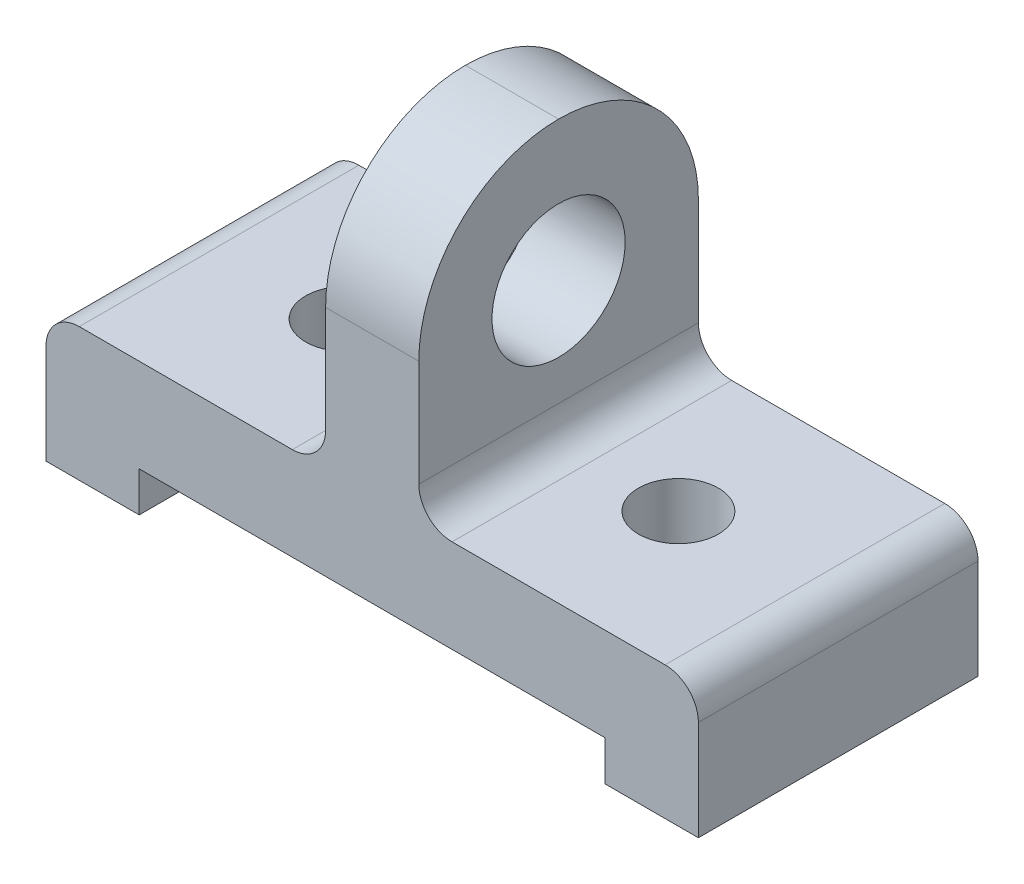
ISO-10303-21;
HEADER;
FILE_DESCRIPTION(('STEP AP214'),'2;1');
FILE_NAME('part.step','',(''),(''),'','','');
FILE_SCHEMA(('AUTOMOTIVE_DESIGN { 1 0 10303 214 1 1 1 1 }'));
ENDSEC;
DATA;
#1=APPLICATION_CONTEXT('core data for automotive mechanical design processes');
#2=APPLICATION_PROTOCOL_DEFINITION('international standard','automotive_design',2000,#1);
#3=PRODUCT_CONTEXT('',#1,'mechanical');
#4=PRODUCT('Part','Part','',(#3));
#5=PRODUCT_RELATED_PRODUCT_CATEGORY('part','',(#4));
#6=PRODUCT_DEFINITION_FORMATION('','',#4);
#7=PRODUCT_DEFINITION_CONTEXT('part definition',#1,'design');
#8=PRODUCT_DEFINITION('design','',#6,#7);
#9=PRODUCT_DEFINITION_SHAPE('','',#8);
#10=(LENGTH_UNIT() NAMED_UNIT(*) SI_UNIT(.MILLI.,.METRE.));
#11=(NAMED_UNIT(*) PLANE_ANGLE_UNIT() SI_UNIT($,.RADIAN.));
#12=(NAMED_UNIT(*) SI_UNIT($,.STERADIAN.) SOLID_ANGLE_UNIT());
#13=UNCERTAINTY_MEASURE_WITH_UNIT(LENGTH_MEASURE(1.E-05),#10,'distance_accuracy_value','');
#14=(GEOMETRIC_REPRESENTATION_CONTEXT(3) GLOBAL_UNCERTAINTY_ASSIGNED_CONTEXT((#13)) GLOBAL_UNIT_ASSIGNED_CONTEXT((#10,
#11,#12)) REPRESENTATION_CONTEXT('',''));
#15=CARTESIAN_POINT('',(0.,0.,0.));
#16=DIRECTION('',(0.,0.,1.));
#17=DIRECTION('',(1.,0.,0.));
#18=AXIS2_PLACEMENT_3D('',#15,#16,#17);
#19=CARTESIAN_POINT('',(0.,50.8,0.));
#20=DIRECTION('',(0.,1.,0.));
#21=DIRECTION('',(0.,0.,1.));
#22=AXIS2_PLACEMENT_3D('',#19,#20,#21);
#23=PLANE('',#22);
#24=CARTESIAN_POINT('',(187.96,50.8,53.34));
#25=DIRECTION('',(0.,1.,0.));
#26=DIRECTION('',(0.,0.,1.));
#27=AXIS2_PLACEMENT_3D('',#24,#25,#26);
#28=CIRCLE('',#27,15.24);
#29=CARTESIAN_POINT('',(187.96,50.8,68.58));
#30=VERTEX_POINT('',#29);
#31=EDGE_CURVE('E316',#30,#30,#28,.T.);
#32=ORIENTED_EDGE('',*,*,#31,.F.);
#33=EDGE_LOOP('',(#32));
#34=FACE_BOUND('',#33,.T.);
#35=DIRECTION('',(-1.,0.,0.));
#36=VECTOR('',#35,1.);
#37=CARTESIAN_POINT('',(0.,50.8,0.));
#38=LINE('',#37,#36);
#39=CARTESIAN_POINT('',(236.22,50.8,0.));
#40=VERTEX_POINT('',#39);
#41=CARTESIAN_POINT('',(154.94,50.8,0.));
#42=VERTEX_POINT('',#41);
#43=EDGE_CURVE('E193',#40,#42,#38,.T.);
#44=ORIENTED_EDGE('',*,*,#43,.T.);
#45=DIRECTION('',(0.,0.,1.));
#46=VECTOR('',#45,1.);
#47=CARTESIAN_POINT('',(154.94,50.8,106.68));
#48=LINE('',#47,#46);
#49=CARTESIAN_POINT('',(154.94,50.8,106.68));
#50=VERTEX_POINT('',#49);
#51=EDGE_CURVE('E258',#42,#50,#48,.T.);
#52=ORIENTED_EDGE('',*,*,#51,.T.);
#53=DIRECTION('',(1.,0.,0.));
#54=VECTOR('',#53,1.);
#55=CARTESIAN_POINT('',(0.,50.8,106.68));
#56=LINE('',#55,#54);
#57=CARTESIAN_POINT('',(236.22,50.8,106.68));
#58=VERTEX_POINT('',#57);
#59=EDGE_CURVE('E191',#50,#58,#56,.T.);
#60=ORIENTED_EDGE('',*,*,#59,.T.);
#61=DIRECTION('',(0.,0.,-1.));
#62=VECTOR('',#61,1.);
#63=CARTESIAN_POINT('',(236.22,50.8,0.));
#64=LINE('',#63,#62);
#65=EDGE_CURVE('E233',#58,#40,#64,.T.);
#66=ORIENTED_EDGE('',*,*,#65,.T.);
#67=EDGE_LOOP('',(#44,#52,#60,#66));
#68=FACE_BOUND('',#67,.T.);
#69=ADVANCED_FACE('F39',(#34,#68),#23,.T.);
#70=CARTESIAN_POINT('',(0.,0.,0.));
#71=DIRECTION('',(0.,1.,0.));
#72=DIRECTION('',(0.,0.,1.));
#73=AXIS2_PLACEMENT_3D('',#70,#71,#72);
#74=PLANE('',#73);
#75=DIRECTION('',(0.,0.,-1.));
#76=VECTOR('',#75,1.);
#77=CARTESIAN_POINT('',(35.56,0.,106.68));
#78=LINE('',#77,#76);
#79=CARTESIAN_POINT('',(35.56,0.,106.68));
#80=VERTEX_POINT('',#79);
#81=CARTESIAN_POINT('',(35.56,0.,0.));
#82=VERTEX_POINT('',#81);
#83=EDGE_CURVE('E310',#80,#82,#78,.T.);
#84=ORIENTED_EDGE('',*,*,#83,.F.);
#85=DIRECTION('',(1.,0.,0.));
#86=VECTOR('',#85,1.);
#87=CARTESIAN_POINT('',(0.,0.,106.68));
#88=LINE('',#87,#86);
#89=CARTESIAN_POINT('',(0.,0.,106.68));
#90=VERTEX_POINT('',#89);
#91=EDGE_CURVE('E203',#90,#80,#88,.T.);
#92=ORIENTED_EDGE('',*,*,#91,.F.);
#93=DIRECTION('',(0.,0.,1.));
#94=VECTOR('',#93,1.);
#95=CARTESIAN_POINT('',(0.,0.,0.));
#96=LINE('',#95,#94);
#97=CARTESIAN_POINT('',(0.,0.,0.));
#98=VERTEX_POINT('',#97);
#99=EDGE_CURVE('E197',#98,#90,#96,.T.);
#100=ORIENTED_EDGE('',*,*,#99,.F.);
#101=DIRECTION('',(-1.,0.,0.));
#102=VECTOR('',#101,1.);
#103=CARTESIAN_POINT('',(0.,0.,0.));
#104=LINE('',#103,#102);
#105=EDGE_CURVE('E209',#82,#98,#104,.T.);
#106=ORIENTED_EDGE('',*,*,#105,.F.);
#107=EDGE_LOOP('',(#84,#92,#100,#106));
#108=FACE_BOUND('',#107,.T.);
#109=ADVANCED_FACE('F306',(#108),#74,.F.);
#110=DIRECTION('',(0.,0.,1.));
#111=VECTOR('',#110,1.);
#112=CARTESIAN_POINT('',(213.36,0.,106.68));
#113=LINE('',#112,#111);
#114=CARTESIAN_POINT('',(213.36,0.,0.));
#115=VERTEX_POINT('',#114);
#116=CARTESIAN_POINT('',(213.36,0.,106.68));
#117=VERTEX_POINT('',#116);
#118=EDGE_CURVE('E311',#115,#117,#113,.T.);
#119=ORIENTED_EDGE('',*,*,#118,.F.);
#120=CARTESIAN_POINT('',(248.92,0.,0.));
#121=VERTEX_POINT('',#120);
#122=EDGE_CURVE('E185',#121,#115,#104,.T.);
#123=ORIENTED_EDGE('',*,*,#122,.F.);
#124=DIRECTION('',(0.,0.,-1.));
#125=VECTOR('',#124,1.);
#126=CARTESIAN_POINT('',(248.92,0.,0.));
#127=LINE('',#126,#125);
#128=CARTESIAN_POINT('',(248.92,0.,106.68));
#129=VERTEX_POINT('',#128);
#130=EDGE_CURVE('E207',#129,#121,#127,.T.);
#131=ORIENTED_EDGE('',*,*,#130,.F.);
#132=EDGE_CURVE('E205',#117,#129,#88,.T.);
#133=ORIENTED_EDGE('',*,*,#132,.F.);
#134=EDGE_LOOP('',(#119,#123,#131,#133));
#135=FACE_BOUND('',#134,.T.);
#136=ADVANCED_FACE('F370',(#135),#74,.F.);
#137=CARTESIAN_POINT('',(0.,50.8,0.));
#138=DIRECTION('',(1.,0.,0.));
#139=DIRECTION('',(0.,0.,-1.));
#140=AXIS2_PLACEMENT_3D('',#137,#138,#139);
#141=PLANE('',#140);
#142=DIRECTION('',(0.,-1.,0.));
#143=VECTOR('',#142,1.);
#144=CARTESIAN_POINT('',(0.,50.8,106.68));
#145=LINE('',#144,#143);
#146=CARTESIAN_POINT('',(0.,38.1,106.68));
#147=VERTEX_POINT('',#146);
#148=EDGE_CURVE('E216',#147,#90,#145,.T.);
#149=ORIENTED_EDGE('',*,*,#148,.F.);
#150=DIRECTION('',(0.,0.,1.));
#151=VECTOR('',#150,1.);
#152=CARTESIAN_POINT('',(0.,38.1,0.));
#153=LINE('',#152,#151);
#154=CARTESIAN_POINT('',(0.,38.1,0.));
#155=VERTEX_POINT('',#154);
#156=EDGE_CURVE('E254',#147,#155,#153,.F.);
#157=ORIENTED_EDGE('',*,*,#156,.T.);
#158=DIRECTION('',(0.,-1.,0.));
#159=VECTOR('',#158,1.);
#160=CARTESIAN_POINT('',(0.,50.8,0.));
#161=LINE('',#160,#159);
#162=EDGE_CURVE('E198',#155,#98,#161,.T.);
#163=ORIENTED_EDGE('',*,*,#162,.T.);
#164=ORIENTED_EDGE('',*,*,#99,.T.);
#165=EDGE_LOOP('',(#149,#157,#163,#164));
#166=FACE_BOUND('',#165,.T.);
#167=ADVANCED_FACE('F299',(#166),#141,.F.);
#168=CARTESIAN_POINT('',(0.,50.8,106.68));
#169=DIRECTION('',(0.,0.,-1.));
#170=DIRECTION('',(-1.,0.,0.));
#171=AXIS2_PLACEMENT_3D('',#168,#169,#170);
#172=PLANE('',#171);
#173=DIRECTION('',(0.,-1.,0.));
#174=VECTOR('',#173,1.);
#175=CARTESIAN_POINT('',(248.92,50.8,106.68));
#176=LINE('',#175,#174);
#177=CARTESIAN_POINT('',(248.92,38.1,106.68));
#178=VERTEX_POINT('',#177);
#179=EDGE_CURVE('E211',#178,#129,#176,.T.);
#180=ORIENTED_EDGE('',*,*,#179,.F.);
#181=CARTESIAN_POINT('',(236.22,38.1,106.68));
#182=DIRECTION('',(0.,0.,-1.));
#183=DIRECTION('',(-1.,0.,0.));
#184=AXIS2_PLACEMENT_3D('',#181,#182,#183);
#185=CIRCLE('',#184,12.7);
#186=EDGE_CURVE('E250',#178,#58,#185,.F.);
#187=ORIENTED_EDGE('',*,*,#186,.T.);
#188=ORIENTED_EDGE('',*,*,#59,.F.);
#189=CARTESIAN_POINT('',(154.94,63.5,106.68));
#190=DIRECTION('',(0.,0.,-1.));
#191=DIRECTION('',(-1.,0.,0.));
#192=AXIS2_PLACEMENT_3D('',#189,#190,#191);
#193=CIRCLE('',#192,12.7);
#194=CARTESIAN_POINT('',(142.24,63.5,106.68));
#195=VERTEX_POINT('',#194);
#196=EDGE_CURVE('E50',#50,#195,#193,.T.);
#197=ORIENTED_EDGE('',*,*,#196,.T.);
#198=DIRECTION('',(0.,-1.,0.));
#199=VECTOR('',#198,1.);
#200=CARTESIAN_POINT('',(142.24,157.48,106.68));
#201=LINE('',#200,#199);
#202=CARTESIAN_POINT('',(142.24,104.14,106.68));
#203=VERTEX_POINT('',#202);
#204=EDGE_CURVE('E327',#203,#195,#201,.T.);
#205=ORIENTED_EDGE('',*,*,#204,.F.);
#206=DIRECTION('',(1.,0.,0.));
#207=VECTOR('',#206,1.);
#208=CARTESIAN_POINT('',(0.,104.14,106.68));
#209=LINE('',#208,#207);
#210=CARTESIAN_POINT('',(106.68,104.14,106.68));
#211=VERTEX_POINT('',#210);
#212=EDGE_CURVE('E225',#203,#211,#209,.F.);
#213=ORIENTED_EDGE('',*,*,#212,.T.);
#214=DIRECTION('',(0.,-1.,0.));
#215=VECTOR('',#214,1.);
#216=CARTESIAN_POINT('',(106.68,157.48,106.68));
#217=LINE('',#216,#215);
#218=CARTESIAN_POINT('',(106.68,63.5,106.68));
#219=VERTEX_POINT('',#218);
#220=EDGE_CURVE('E285',#211,#219,#217,.T.);
#221=ORIENTED_EDGE('',*,*,#220,.T.);
#222=CARTESIAN_POINT('',(93.98,63.5,106.68));
#223=DIRECTION('',(0.,0.,-1.));
#224=DIRECTION('',(-1.,0.,0.));
#225=AXIS2_PLACEMENT_3D('',#222,#223,#224);
#226=CIRCLE('',#225,12.7);
#227=CARTESIAN_POINT('',(93.98,50.8,106.68));
#228=VERTEX_POINT('',#227);
#229=EDGE_CURVE('E262',#219,#228,#226,.T.);
#230=ORIENTED_EDGE('',*,*,#229,.T.);
#231=CARTESIAN_POINT('',(12.7,50.8,106.68));
#232=VERTEX_POINT('',#231);
#233=EDGE_CURVE('E188',#232,#228,#56,.T.);
#234=ORIENTED_EDGE('',*,*,#233,.F.);
#235=CARTESIAN_POINT('',(12.7,38.1,106.68));
#236=DIRECTION('',(0.,0.,-1.));
#237=DIRECTION('',(-1.,0.,0.));
#238=AXIS2_PLACEMENT_3D('',#235,#236,#237);
#239=CIRCLE('',#238,12.7);
#240=EDGE_CURVE('E244',#232,#147,#239,.F.);
#241=ORIENTED_EDGE('',*,*,#240,.T.);
#242=ORIENTED_EDGE('',*,*,#148,.T.);
#243=ORIENTED_EDGE('',*,*,#91,.T.);
#244=DIRECTION('',(0.,-1.,0.));
#245=VECTOR('',#244,1.);
#246=CARTESIAN_POINT('',(35.56,15.24,106.68));
#247=LINE('',#246,#245);
#248=CARTESIAN_POINT('',(35.56,15.24,106.68));
#249=VERTEX_POINT('',#248);
#250=EDGE_CURVE('E184',#249,#80,#247,.T.);
#251=ORIENTED_EDGE('',*,*,#250,.F.);
#252=DIRECTION('',(-1.,0.,0.));
#253=VECTOR('',#252,1.);
#254=CARTESIAN_POINT('',(35.56,15.24,106.68));
#255=LINE('',#254,#253);
#256=CARTESIAN_POINT('',(213.36,15.24,106.68));
#257=VERTEX_POINT('',#256);
#258=EDGE_CURVE('E166',#257,#249,#255,.T.);
#259=ORIENTED_EDGE('',*,*,#258,.F.);
#260=DIRECTION('',(0.,-1.,0.));
#261=VECTOR('',#260,1.);
#262=CARTESIAN_POINT('',(213.36,15.24,106.68));
#263=LINE('',#262,#261);
#264=EDGE_CURVE('E165',#257,#117,#263,.T.);
#265=ORIENTED_EDGE('',*,*,#264,.T.);
#266=ORIENTED_EDGE('',*,*,#132,.T.);
#267=EDGE_LOOP('',(#180,#187,#188,#197,#205,#213,#221,#230,#234,#241,#242,#243,#251,#259,#265,#266));
#268=FACE_BOUND('',#267,.T.);
#269=ADVANCED_FACE('F290',(#268),#172,.F.);
#270=CARTESIAN_POINT('',(248.92,50.8,0.));
#271=DIRECTION('',(-1.,0.,0.));
#272=DIRECTION('',(0.,0.,1.));
#273=AXIS2_PLACEMENT_3D('',#270,#271,#272);
#274=PLANE('',#273);
#275=DIRECTION('',(0.,-1.,0.));
#276=VECTOR('',#275,1.);
#277=CARTESIAN_POINT('',(248.92,50.8,0.));
#278=LINE('',#277,#276);
#279=CARTESIAN_POINT('',(248.92,38.1,0.));
#280=VERTEX_POINT('',#279);
#281=EDGE_CURVE('E215',#280,#121,#278,.T.);
#282=ORIENTED_EDGE('',*,*,#281,.F.);
#283=DIRECTION('',(0.,0.,-1.));
#284=VECTOR('',#283,1.);
#285=CARTESIAN_POINT('',(248.92,38.1,106.68));
#286=LINE('',#285,#284);
#287=EDGE_CURVE('E243',#280,#178,#286,.F.);
#288=ORIENTED_EDGE('',*,*,#287,.T.);
#289=ORIENTED_EDGE('',*,*,#179,.T.);
#290=ORIENTED_EDGE('',*,*,#130,.T.);
#291=EDGE_LOOP('',(#282,#288,#289,#290));
#292=FACE_BOUND('',#291,.T.);
#293=ADVANCED_FACE('F365',(#292),#274,.F.);
#294=CARTESIAN_POINT('',(0.,50.8,0.));
#295=DIRECTION('',(0.,0.,1.));
#296=DIRECTION('',(1.,0.,0.));
#297=AXIS2_PLACEMENT_3D('',#294,#295,#296);
#298=PLANE('',#297);
#299=ORIENTED_EDGE('',*,*,#43,.F.);
#300=CARTESIAN_POINT('',(236.22,38.1,0.));
#301=DIRECTION('',(0.,0.,1.));
#302=DIRECTION('',(1.,0.,0.));
#303=AXIS2_PLACEMENT_3D('',#300,#301,#302);
#304=CIRCLE('',#303,12.7);
#305=EDGE_CURVE('E241',#40,#280,#304,.F.);
#306=ORIENTED_EDGE('',*,*,#305,.T.);
#307=ORIENTED_EDGE('',*,*,#281,.T.);
#308=ORIENTED_EDGE('',*,*,#122,.T.);
#309=DIRECTION('',(0.,-1.,0.));
#310=VECTOR('',#309,1.);
#311=CARTESIAN_POINT('',(213.36,15.24,0.));
#312=LINE('',#311,#310);
#313=CARTESIAN_POINT('',(213.36,15.24,0.));
#314=VERTEX_POINT('',#313);
#315=EDGE_CURVE('E163',#314,#115,#312,.T.);
#316=ORIENTED_EDGE('',*,*,#315,.F.);
#317=DIRECTION('',(1.,0.,0.));
#318=VECTOR('',#317,1.);
#319=CARTESIAN_POINT('',(35.56,15.24,0.));
#320=LINE('',#319,#318);
#321=CARTESIAN_POINT('',(35.56,15.24,0.));
#322=VERTEX_POINT('',#321);
#323=EDGE_CURVE('E169',#322,#314,#320,.T.);
#324=ORIENTED_EDGE('',*,*,#323,.F.);
#325=DIRECTION('',(0.,-1.,0.));
#326=VECTOR('',#325,1.);
#327=CARTESIAN_POINT('',(35.56,15.24,0.));
#328=LINE('',#327,#326);
#329=EDGE_CURVE('E182',#322,#82,#328,.T.);
#330=ORIENTED_EDGE('',*,*,#329,.T.);
#331=ORIENTED_EDGE('',*,*,#105,.T.);
#332=ORIENTED_EDGE('',*,*,#162,.F.);
#333=CARTESIAN_POINT('',(12.7,38.1,0.));
#334=DIRECTION('',(0.,0.,1.));
#335=DIRECTION('',(1.,0.,0.));
#336=AXIS2_PLACEMENT_3D('',#333,#334,#335);
#337=CIRCLE('',#336,12.7);
#338=CARTESIAN_POINT('',(12.7,50.8,0.));
#339=VERTEX_POINT('',#338);
#340=EDGE_CURVE('E238',#155,#339,#337,.F.);
#341=ORIENTED_EDGE('',*,*,#340,.T.);
#342=CARTESIAN_POINT('',(93.98,50.8,0.));
#343=VERTEX_POINT('',#342);
#344=EDGE_CURVE('E194',#343,#339,#38,.T.);
#345=ORIENTED_EDGE('',*,*,#344,.F.);
#346=CARTESIAN_POINT('',(93.98,63.5,0.));
#347=DIRECTION('',(0.,0.,1.));
#348=DIRECTION('',(1.,0.,0.));
#349=AXIS2_PLACEMENT_3D('',#346,#347,#348);
#350=CIRCLE('',#349,12.7);
#351=CARTESIAN_POINT('',(106.68,63.5,0.));
#352=VERTEX_POINT('',#351);
#353=EDGE_CURVE('E266',#343,#352,#350,.T.);
#354=ORIENTED_EDGE('',*,*,#353,.T.);
#355=DIRECTION('',(0.,-1.,0.));
#356=VECTOR('',#355,1.);
#357=CARTESIAN_POINT('',(106.68,157.48,0.));
#358=LINE('',#357,#356);
#359=CARTESIAN_POINT('',(106.68,104.14,0.));
#360=VERTEX_POINT('',#359);
#361=EDGE_CURVE('E272',#360,#352,#358,.T.);
#362=ORIENTED_EDGE('',*,*,#361,.F.);
#363=DIRECTION('',(1.,0.,0.));
#364=VECTOR('',#363,1.);
#365=CARTESIAN_POINT('',(0.,104.14,0.));
#366=LINE('',#365,#364);
#367=CARTESIAN_POINT('',(142.24,104.14,0.));
#368=VERTEX_POINT('',#367);
#369=EDGE_CURVE('E230',#360,#368,#366,.T.);
#370=ORIENTED_EDGE('',*,*,#369,.T.);
#371=DIRECTION('',(0.,-1.,0.));
#372=VECTOR('',#371,1.);
#373=CARTESIAN_POINT('',(142.24,157.48,0.));
#374=LINE('',#373,#372);
#375=CARTESIAN_POINT('',(142.24,63.5,0.));
#376=VERTEX_POINT('',#375);
#377=EDGE_CURVE('E330',#368,#376,#374,.T.);
#378=ORIENTED_EDGE('',*,*,#377,.T.);
#379=CARTESIAN_POINT('',(154.94,63.5,0.));
#380=DIRECTION('',(0.,0.,1.));
#381=DIRECTION('',(1.,0.,0.));
#382=AXIS2_PLACEMENT_3D('',#379,#380,#381);
#383=CIRCLE('',#382,12.7);
#384=EDGE_CURVE('E11',#376,#42,#383,.T.);
#385=ORIENTED_EDGE('',*,*,#384,.T.);
#386=EDGE_LOOP('',(#299,#306,#307,#308,#316,#324,#330,#331,#332,#341,#345,#354,#362,#370,#378,#385));
#387=FACE_BOUND('',#386,.T.);
#388=ADVANCED_FACE('F179',(#387),#298,.F.);
#389=ORIENTED_EDGE('',*,*,#233,.T.);
#390=DIRECTION('',(0.,0.,1.));
#391=VECTOR('',#390,1.);
#392=CARTESIAN_POINT('',(93.98,50.8,0.));
#393=LINE('',#392,#391);
#394=EDGE_CURVE('E259',#228,#343,#393,.F.);
#395=ORIENTED_EDGE('',*,*,#394,.T.);
#396=ORIENTED_EDGE('',*,*,#344,.T.);
#397=DIRECTION('',(0.,0.,1.));
#398=VECTOR('',#397,1.);
#399=CARTESIAN_POINT('',(12.7,50.8,106.68));
#400=LINE('',#399,#398);
#401=EDGE_CURVE('E249',#339,#232,#400,.T.);
#402=ORIENTED_EDGE('',*,*,#401,.T.);
#403=EDGE_LOOP('',(#389,#395,#396,#402));
#404=FACE_BOUND('',#403,.T.);
#405=CARTESIAN_POINT('',(60.96,50.8,53.34));
#406=DIRECTION('',(0.,1.,0.));
#407=DIRECTION('',(0.,0.,1.));
#408=AXIS2_PLACEMENT_3D('',#405,#406,#407);
#409=CIRCLE('',#408,15.24);
#410=CARTESIAN_POINT('',(60.96,50.8,68.58));
#411=VERTEX_POINT('',#410);
#412=EDGE_CURVE('E325',#411,#411,#409,.T.);
#413=ORIENTED_EDGE('',*,*,#412,.F.);
#414=EDGE_LOOP('',(#413));
#415=FACE_BOUND('',#414,.T.);
#416=ADVANCED_FACE('F287',(#404,#415),#23,.T.);
#417=CARTESIAN_POINT('',(35.56,15.24,106.68));
#418=DIRECTION('',(-1.,0.,0.));
#419=DIRECTION('',(0.,0.,1.));
#420=AXIS2_PLACEMENT_3D('',#417,#418,#419);
#421=PLANE('',#420);
#422=ORIENTED_EDGE('',*,*,#83,.T.);
#423=ORIENTED_EDGE('',*,*,#329,.F.);
#424=DIRECTION('',(0.,0.,-1.));
#425=VECTOR('',#424,1.);
#426=CARTESIAN_POINT('',(35.56,15.24,106.68));
#427=LINE('',#426,#425);
#428=EDGE_CURVE('E173',#249,#322,#427,.T.);
#429=ORIENTED_EDGE('',*,*,#428,.F.);
#430=ORIENTED_EDGE('',*,*,#250,.T.);
#431=EDGE_LOOP('',(#422,#423,#429,#430));
#432=FACE_BOUND('',#431,.T.);
#433=ADVANCED_FACE('F390',(#432),#421,.F.);
#434=CARTESIAN_POINT('',(213.36,15.24,106.68));
#435=DIRECTION('',(1.,0.,0.));
#436=DIRECTION('',(0.,0.,-1.));
#437=AXIS2_PLACEMENT_3D('',#434,#435,#436);
#438=PLANE('',#437);
#439=ORIENTED_EDGE('',*,*,#118,.T.);
#440=ORIENTED_EDGE('',*,*,#264,.F.);
#441=DIRECTION('',(0.,0.,1.));
#442=VECTOR('',#441,1.);
#443=CARTESIAN_POINT('',(213.36,15.24,106.68));
#444=LINE('',#443,#442);
#445=EDGE_CURVE('E160',#314,#257,#444,.T.);
#446=ORIENTED_EDGE('',*,*,#445,.F.);
#447=ORIENTED_EDGE('',*,*,#315,.T.);
#448=EDGE_LOOP('',(#439,#440,#446,#447));
#449=FACE_BOUND('',#448,.T.);
#450=ADVANCED_FACE('F157',(#449),#438,.F.);
#451=CARTESIAN_POINT('',(0.,15.24,0.));
#452=DIRECTION('',(0.,-1.,0.));
#453=DIRECTION('',(0.,0.,-1.));
#454=AXIS2_PLACEMENT_3D('',#451,#452,#453);
#455=PLANE('',#454);
#456=CARTESIAN_POINT('',(60.96,15.24,53.34));
#457=DIRECTION('',(0.,1.,0.));
#458=DIRECTION('',(0.,0.,1.));
#459=AXIS2_PLACEMENT_3D('',#456,#457,#458);
#460=CIRCLE('',#459,15.24);
#461=CARTESIAN_POINT('',(60.96,15.24,68.58));
#462=VERTEX_POINT('',#461);
#463=EDGE_CURVE('E313',#462,#462,#460,.T.);
#464=ORIENTED_EDGE('',*,*,#463,.T.);
#465=EDGE_LOOP('',(#464));
#466=FACE_BOUND('',#465,.T.);
#467=CARTESIAN_POINT('',(187.96,15.24,53.34));
#468=DIRECTION('',(0.,1.,0.));
#469=DIRECTION('',(0.,0.,1.));
#470=AXIS2_PLACEMENT_3D('',#467,#468,#469);
#471=CIRCLE('',#470,15.24);
#472=CARTESIAN_POINT('',(187.96,15.24,68.58));
#473=VERTEX_POINT('',#472);
#474=EDGE_CURVE('E281',#473,#473,#471,.T.);
#475=ORIENTED_EDGE('',*,*,#474,.T.);
#476=EDGE_LOOP('',(#475));
#477=FACE_BOUND('',#476,.T.);
#478=ORIENTED_EDGE('',*,*,#428,.T.);
#479=ORIENTED_EDGE('',*,*,#323,.T.);
#480=ORIENTED_EDGE('',*,*,#445,.T.);
#481=ORIENTED_EDGE('',*,*,#258,.T.);
#482=EDGE_LOOP('',(#478,#479,#480,#481));
#483=FACE_BOUND('',#482,.T.);
#484=ADVANCED_FACE('F175',(#466,#477,#483),#455,.T.);
#485=CARTESIAN_POINT('',(187.96,15.24,53.34));
#486=DIRECTION('',(0.,1.,0.));
#487=DIRECTION('',(0.,0.,1.));
#488=AXIS2_PLACEMENT_3D('',#485,#486,#487);
#489=CYLINDRICAL_SURFACE('',#488,15.24);
#490=ORIENTED_EDGE('',*,*,#474,.F.);
#491=EDGE_LOOP('',(#490));
#492=FACE_BOUND('',#491,.T.);
#493=ORIENTED_EDGE('',*,*,#31,.T.);
#494=EDGE_LOOP('',(#493));
#495=FACE_BOUND('',#494,.T.);
#496=ADVANCED_FACE('F493',(#492,#495),#489,.F.);
#497=CARTESIAN_POINT('',(60.96,15.24,53.34));
#498=DIRECTION('',(0.,1.,0.));
#499=DIRECTION('',(0.,0.,1.));
#500=AXIS2_PLACEMENT_3D('',#497,#498,#499);
#501=CYLINDRICAL_SURFACE('',#500,15.24);
#502=ORIENTED_EDGE('',*,*,#463,.F.);
#503=EDGE_LOOP('',(#502));
#504=FACE_BOUND('',#503,.T.);
#505=ORIENTED_EDGE('',*,*,#412,.T.);
#506=EDGE_LOOP('',(#505));
#507=FACE_BOUND('',#506,.T.);
#508=ADVANCED_FACE('F465',(#504,#507),#501,.F.);
#509=CARTESIAN_POINT('',(106.68,157.48,0.));
#510=DIRECTION('',(1.,0.,0.));
#511=DIRECTION('',(0.,0.,-1.));
#512=AXIS2_PLACEMENT_3D('',#509,#510,#511);
#513=PLANE('',#512);
#514=CARTESIAN_POINT('',(106.68,104.14,53.34));
#515=DIRECTION('',(1.,0.,0.));
#516=DIRECTION('',(0.,0.,-1.));
#517=AXIS2_PLACEMENT_3D('',#514,#515,#516);
#518=CIRCLE('',#517,25.4);
#519=CARTESIAN_POINT('',(106.68,104.14,27.94));
#520=VERTEX_POINT('',#519);
#521=EDGE_CURVE('E329',#520,#520,#518,.T.);
#522=ORIENTED_EDGE('',*,*,#521,.T.);
#523=EDGE_LOOP('',(#522));
#524=FACE_BOUND('',#523,.T.);
#525=ORIENTED_EDGE('',*,*,#361,.T.);
#526=DIRECTION('',(0.,0.,1.));
#527=VECTOR('',#526,1.);
#528=CARTESIAN_POINT('',(106.68,63.5,0.));
#529=LINE('',#528,#527);
#530=EDGE_CURVE('E253',#352,#219,#529,.T.);
#531=ORIENTED_EDGE('',*,*,#530,.T.);
#532=ORIENTED_EDGE('',*,*,#220,.F.);
#533=CARTESIAN_POINT('',(106.68,104.14,53.34));
#534=DIRECTION('',(1.,0.,0.));
#535=DIRECTION('',(0.,0.,-1.));
#536=AXIS2_PLACEMENT_3D('',#533,#534,#535);
#537=CIRCLE('',#536,53.34);
#538=CARTESIAN_POINT('',(106.68,157.48,53.34));
#539=VERTEX_POINT('',#538);
#540=EDGE_CURVE('E227',#211,#539,#537,.F.);
#541=ORIENTED_EDGE('',*,*,#540,.T.);
#542=CARTESIAN_POINT('',(106.68,104.14,53.34));
#543=DIRECTION('',(1.,0.,0.));
#544=DIRECTION('',(0.,0.,-1.));
#545=AXIS2_PLACEMENT_3D('',#542,#543,#544);
#546=CIRCLE('',#545,53.34);
#547=EDGE_CURVE('E224',#539,#360,#546,.F.);
#548=ORIENTED_EDGE('',*,*,#547,.T.);
#549=EDGE_LOOP('',(#525,#531,#532,#541,#548));
#550=FACE_BOUND('',#549,.T.);
#551=ADVANCED_FACE('F280',(#524,#550),#513,.F.);
#552=CARTESIAN_POINT('',(142.24,157.48,0.));
#553=DIRECTION('',(1.,0.,0.));
#554=DIRECTION('',(0.,0.,-1.));
#555=AXIS2_PLACEMENT_3D('',#552,#553,#554);
#556=PLANE('',#555);
#557=CARTESIAN_POINT('',(142.24,104.14,53.34));
#558=DIRECTION('',(1.,0.,0.));
#559=DIRECTION('',(0.,0.,-1.));
#560=AXIS2_PLACEMENT_3D('',#557,#558,#559);
#561=CIRCLE('',#560,25.4);
#562=CARTESIAN_POINT('',(142.24,104.14,27.94));
#563=VERTEX_POINT('',#562);
#564=EDGE_CURVE('E232',#563,#563,#561,.T.);
#565=ORIENTED_EDGE('',*,*,#564,.F.);
#566=EDGE_LOOP('',(#565));
#567=FACE_BOUND('',#566,.T.);
#568=ORIENTED_EDGE('',*,*,#204,.T.);
#569=DIRECTION('',(0.,0.,1.));
#570=VECTOR('',#569,1.);
#571=CARTESIAN_POINT('',(142.24,63.5,0.));
#572=LINE('',#571,#570);
#573=EDGE_CURVE('E53',#195,#376,#572,.F.);
#574=ORIENTED_EDGE('',*,*,#573,.T.);
#575=ORIENTED_EDGE('',*,*,#377,.F.);
#576=CARTESIAN_POINT('',(142.24,104.14,53.34));
#577=DIRECTION('',(1.,0.,0.));
#578=DIRECTION('',(0.,0.,-1.));
#579=AXIS2_PLACEMENT_3D('',#576,#577,#578);
#580=CIRCLE('',#579,53.34);
#581=CARTESIAN_POINT('',(142.24,157.48,53.34));
#582=VERTEX_POINT('',#581);
#583=EDGE_CURVE('E218',#368,#582,#580,.T.);
#584=ORIENTED_EDGE('',*,*,#583,.T.);
#585=CARTESIAN_POINT('',(142.24,104.14,53.34));
#586=DIRECTION('',(1.,0.,0.));
#587=DIRECTION('',(0.,0.,-1.));
#588=AXIS2_PLACEMENT_3D('',#585,#586,#587);
#589=CIRCLE('',#588,53.34);
#590=EDGE_CURVE('E219',#582,#203,#589,.T.);
#591=ORIENTED_EDGE('',*,*,#590,.T.);
#592=EDGE_LOOP('',(#568,#574,#575,#584,#591));
#593=FACE_BOUND('',#592,.T.);
#594=ADVANCED_FACE('F344',(#567,#593),#556,.T.);
#595=CARTESIAN_POINT('',(106.68,104.14,53.34));
#596=DIRECTION('',(1.,0.,0.));
#597=DIRECTION('',(0.,0.,-1.));
#598=AXIS2_PLACEMENT_3D('',#595,#596,#597);
#599=CYLINDRICAL_SURFACE('',#598,25.4);
#600=ORIENTED_EDGE('',*,*,#521,.F.);
#601=EDGE_LOOP('',(#600));
#602=FACE_BOUND('',#601,.T.);
#603=ORIENTED_EDGE('',*,*,#564,.T.);
#604=EDGE_LOOP('',(#603));
#605=FACE_BOUND('',#604,.T.);
#606=ADVANCED_FACE('F339',(#602,#605),#599,.F.);
#607=CARTESIAN_POINT('',(0.,104.14,53.34));
#608=DIRECTION('',(1.,0.,0.));
#609=DIRECTION('',(0.,0.,-1.));
#610=AXIS2_PLACEMENT_3D('',#607,#608,#609);
#611=CYLINDRICAL_SURFACE('',#610,53.34);
#612=ORIENTED_EDGE('',*,*,#369,.F.);
#613=ORIENTED_EDGE('',*,*,#547,.F.);
#614=DIRECTION('',(1.,0.,0.));
#615=VECTOR('',#614,1.);
#616=CARTESIAN_POINT('',(0.,157.48,53.34));
#617=LINE('',#616,#615);
#618=EDGE_CURVE('E235',#582,#539,#617,.F.);
#619=ORIENTED_EDGE('',*,*,#618,.F.);
#620=ORIENTED_EDGE('',*,*,#583,.F.);
#621=EDGE_LOOP('',(#612,#613,#619,#620));
#622=FACE_BOUND('',#621,.T.);
#623=ADVANCED_FACE('F345',(#622),#611,.T.);
#624=CARTESIAN_POINT('',(0.,104.14,53.34));
#625=DIRECTION('',(1.,0.,0.));
#626=DIRECTION('',(0.,0.,-1.));
#627=AXIS2_PLACEMENT_3D('',#624,#625,#626);
#628=CYLINDRICAL_SURFACE('',#627,53.34);
#629=ORIENTED_EDGE('',*,*,#540,.F.);
#630=ORIENTED_EDGE('',*,*,#212,.F.);
#631=ORIENTED_EDGE('',*,*,#590,.F.);
#632=ORIENTED_EDGE('',*,*,#618,.T.);
#633=EDGE_LOOP('',(#629,#630,#631,#632));
#634=FACE_BOUND('',#633,.T.);
#635=ADVANCED_FACE('F398',(#634),#628,.T.);
#636=CARTESIAN_POINT('',(236.22,38.1,0.));
#637=DIRECTION('',(0.,0.,1.));
#638=DIRECTION('',(1.,0.,0.));
#639=AXIS2_PLACEMENT_3D('',#636,#637,#638);
#640=CYLINDRICAL_SURFACE('',#639,12.7);
#641=ORIENTED_EDGE('',*,*,#186,.F.);
#642=ORIENTED_EDGE('',*,*,#287,.F.);
#643=ORIENTED_EDGE('',*,*,#305,.F.);
#644=ORIENTED_EDGE('',*,*,#65,.F.);
#645=EDGE_LOOP('',(#641,#642,#643,#644));
#646=FACE_BOUND('',#645,.T.);
#647=ADVANCED_FACE('F356',(#646),#640,.T.);
#648=CARTESIAN_POINT('',(12.7,38.1,0.));
#649=DIRECTION('',(0.,0.,-1.));
#650=DIRECTION('',(-1.,0.,0.));
#651=AXIS2_PLACEMENT_3D('',#648,#649,#650);
#652=CYLINDRICAL_SURFACE('',#651,12.7);
#653=ORIENTED_EDGE('',*,*,#340,.F.);
#654=ORIENTED_EDGE('',*,*,#156,.F.);
#655=ORIENTED_EDGE('',*,*,#240,.F.);
#656=ORIENTED_EDGE('',*,*,#401,.F.);
#657=EDGE_LOOP('',(#653,#654,#655,#656));
#658=FACE_BOUND('',#657,.T.);
#659=ADVANCED_FACE('F295',(#658),#652,.T.);
#660=CARTESIAN_POINT('',(93.98,63.5,0.));
#661=DIRECTION('',(0.,0.,1.));
#662=DIRECTION('',(1.,0.,0.));
#663=AXIS2_PLACEMENT_3D('',#660,#661,#662);
#664=CYLINDRICAL_SURFACE('',#663,12.7);
#665=ORIENTED_EDGE('',*,*,#353,.F.);
#666=ORIENTED_EDGE('',*,*,#394,.F.);
#667=ORIENTED_EDGE('',*,*,#229,.F.);
#668=ORIENTED_EDGE('',*,*,#530,.F.);
#669=EDGE_LOOP('',(#665,#666,#667,#668));
#670=FACE_BOUND('',#669,.T.);
#671=ADVANCED_FACE('F282',(#670),#664,.F.);
#672=CARTESIAN_POINT('',(154.94,63.5,0.));
#673=DIRECTION('',(0.,0.,-1.));
#674=DIRECTION('',(-1.,0.,0.));
#675=AXIS2_PLACEMENT_3D('',#672,#673,#674);
#676=CYLINDRICAL_SURFACE('',#675,12.7);
#677=ORIENTED_EDGE('',*,*,#384,.F.);
#678=ORIENTED_EDGE('',*,*,#573,.F.);
#679=ORIENTED_EDGE('',*,*,#196,.F.);
#680=ORIENTED_EDGE('',*,*,#51,.F.);
#681=EDGE_LOOP('',(#677,#678,#679,#680));
#682=FACE_BOUND('',#681,.T.);
#683=ADVANCED_FACE('F41',(#682),#676,.F.);
#684=CLOSED_SHELL('',(#69,#109,#136,#167,#269,#293,#388,#416,#433,#450,#484,#496,#508,#551,#594,
#606,#623,#635,#647,#659,#671,#683));
#685=MANIFOLD_SOLID_BREP('B2',#684);
#686=ADVANCED_BREP_SHAPE_REPRESENTATION('',(#18,#685),#14);
#687=SHAPE_DEFINITION_REPRESENTATION(#9,#686);
ENDSEC;
END-ISO-10303-21;
